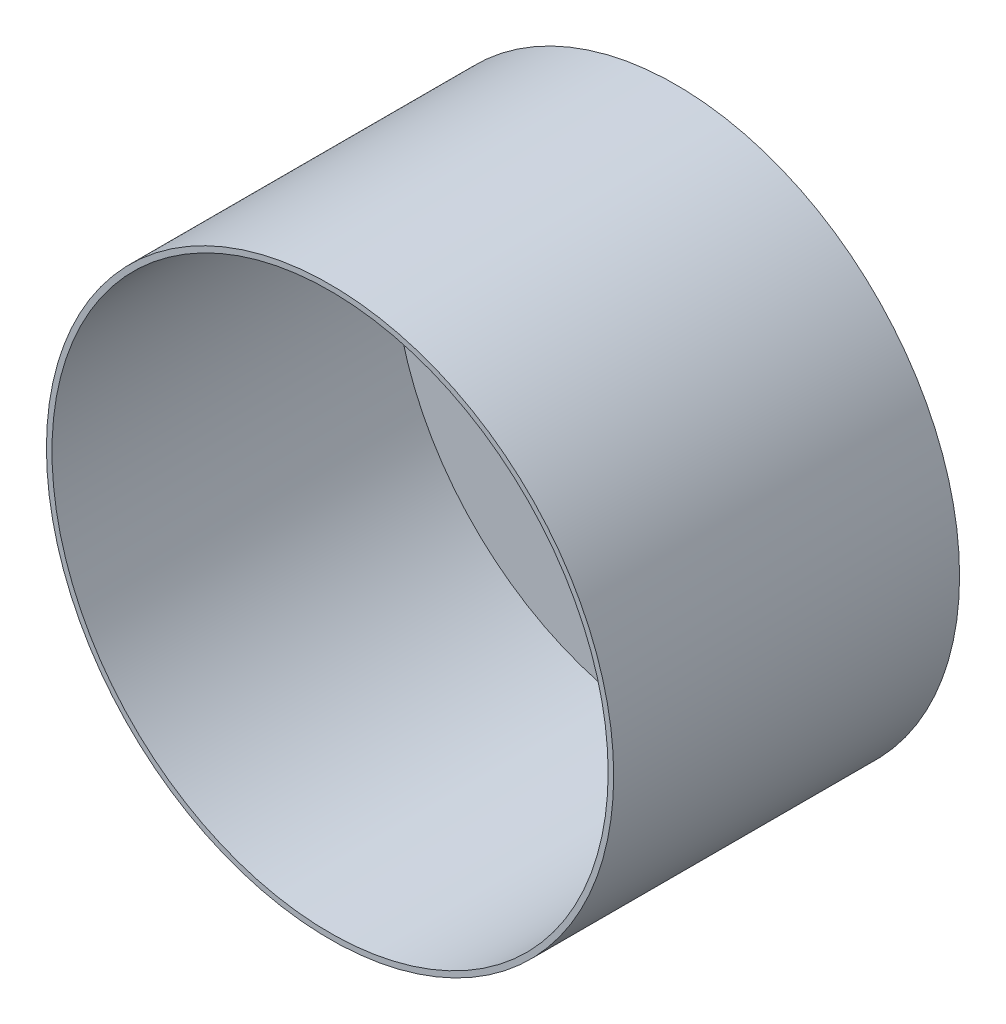
ISO-10303-21;
HEADER;
FILE_DESCRIPTION(('STEP AP214'),'2;1');
FILE_NAME('part.step','',(''),(''),'','','');
FILE_SCHEMA(('AUTOMOTIVE_DESIGN { 1 0 10303 214 1 1 1 1 }'));
ENDSEC;
DATA;
#1=APPLICATION_CONTEXT('core data for automotive mechanical design processes');
#2=APPLICATION_PROTOCOL_DEFINITION('international standard','automotive_design',2000,#1);
#3=PRODUCT_CONTEXT('',#1,'mechanical');
#4=PRODUCT('Part','Part','',(#3));
#5=PRODUCT_RELATED_PRODUCT_CATEGORY('part','',(#4));
#6=PRODUCT_DEFINITION_FORMATION('','',#4);
#7=PRODUCT_DEFINITION_CONTEXT('part definition',#1,'design');
#8=PRODUCT_DEFINITION('design','',#6,#7);
#9=PRODUCT_DEFINITION_SHAPE('','',#8);
#10=(LENGTH_UNIT() NAMED_UNIT(*) SI_UNIT(.MILLI.,.METRE.));
#11=(NAMED_UNIT(*) PLANE_ANGLE_UNIT() SI_UNIT($,.RADIAN.));
#12=(NAMED_UNIT(*) SI_UNIT($,.STERADIAN.) SOLID_ANGLE_UNIT());
#13=UNCERTAINTY_MEASURE_WITH_UNIT(LENGTH_MEASURE(1.E-05),#10,'distance_accuracy_value','');
#14=(GEOMETRIC_REPRESENTATION_CONTEXT(3) GLOBAL_UNCERTAINTY_ASSIGNED_CONTEXT((#13)) GLOBAL_UNIT_ASSIGNED_CONTEXT((#10,
#11,#12)) REPRESENTATION_CONTEXT('',''));
#15=CARTESIAN_POINT('',(0.,0.,0.));
#16=DIRECTION('',(0.,0.,1.));
#17=DIRECTION('',(1.,0.,0.));
#18=AXIS2_PLACEMENT_3D('',#15,#16,#17);
#19=CARTESIAN_POINT('',(0.,0.,1.5));
#20=DIRECTION('',(0.,0.,-1.));
#21=DIRECTION('',(-1.,0.,0.));
#22=AXIS2_PLACEMENT_3D('',#19,#20,#21);
#23=CYLINDRICAL_SURFACE('',#22,50.5);
#24=CARTESIAN_POINT('',(0.,0.,1.5));
#25=DIRECTION('',(0.,0.,1.));
#26=DIRECTION('',(1.,0.,0.));
#27=AXIS2_PLACEMENT_3D('',#24,#25,#26);
#28=CIRCLE('',#27,50.5);
#29=CARTESIAN_POINT('',(50.5,0.,1.5));
#30=VERTEX_POINT('',#29);
#31=EDGE_CURVE('E10',#30,#30,#28,.T.);
#32=ORIENTED_EDGE('',*,*,#31,.T.);
#33=EDGE_LOOP('',(#32));
#34=FACE_BOUND('',#33,.T.);
#35=CARTESIAN_POINT('',(0.,0.,0.));
#36=DIRECTION('',(0.,0.,1.));
#37=DIRECTION('',(1.,0.,0.));
#38=AXIS2_PLACEMENT_3D('',#35,#36,#37);
#39=CIRCLE('',#38,50.5);
#40=CARTESIAN_POINT('',(50.5,0.,0.));
#41=VERTEX_POINT('',#40);
#42=EDGE_CURVE('E40',#41,#41,#39,.T.);
#43=ORIENTED_EDGE('',*,*,#42,.F.);
#44=EDGE_LOOP('',(#43));
#45=FACE_BOUND('',#44,.T.);
#46=ADVANCED_FACE('F37',(#34,#45),#23,.F.);
#47=CARTESIAN_POINT('',(0.,0.,1.5));
#48=DIRECTION('',(0.,0.,1.));
#49=DIRECTION('',(1.,0.,0.));
#50=AXIS2_PLACEMENT_3D('',#47,#48,#49);
#51=PLANE('',#50);
#52=ORIENTED_EDGE('',*,*,#31,.F.);
#53=EDGE_LOOP('',(#52));
#54=FACE_BOUND('',#53,.T.);
#55=CARTESIAN_POINT('',(0.,0.,1.5));
#56=DIRECTION('',(0.,0.,1.));
#57=DIRECTION('',(1.,0.,0.));
#58=AXIS2_PLACEMENT_3D('',#55,#56,#57);
#59=CIRCLE('',#58,100.5);
#60=CARTESIAN_POINT('',(100.5,0.,1.5));
#61=VERTEX_POINT('',#60);
#62=EDGE_CURVE('E47',#61,#61,#59,.F.);
#63=ORIENTED_EDGE('',*,*,#62,.F.);
#64=EDGE_LOOP('',(#63));
#65=FACE_BOUND('',#64,.T.);
#66=ADVANCED_FACE('F77',(#54,#65),#51,.T.);
#67=CARTESIAN_POINT('',(0.,0.,0.));
#68=DIRECTION('',(0.,0.,1.));
#69=DIRECTION('',(1.,0.,0.));
#70=AXIS2_PLACEMENT_3D('',#67,#68,#69);
#71=PLANE('',#70);
#72=ORIENTED_EDGE('',*,*,#42,.T.);
#73=EDGE_LOOP('',(#72));
#74=FACE_BOUND('',#73,.T.);
#75=CARTESIAN_POINT('',(0.,0.,0.));
#76=DIRECTION('',(0.,0.,1.));
#77=DIRECTION('',(1.,0.,0.));
#78=AXIS2_PLACEMENT_3D('',#75,#76,#77);
#79=CIRCLE('',#78,102.5);
#80=CARTESIAN_POINT('',(102.5,0.,0.));
#81=VERTEX_POINT('',#80);
#82=EDGE_CURVE('E52',#81,#81,#79,.T.);
#83=ORIENTED_EDGE('',*,*,#82,.F.);
#84=EDGE_LOOP('',(#83));
#85=FACE_BOUND('',#84,.T.);
#86=ADVANCED_FACE('F75',(#74,#85),#71,.F.);
#87=CARTESIAN_POINT('',(0.,0.,125.));
#88=DIRECTION('',(0.,0.,-1.));
#89=DIRECTION('',(-1.,0.,0.));
#90=AXIS2_PLACEMENT_3D('',#87,#88,#89);
#91=CYLINDRICAL_SURFACE('',#90,100.5);
#92=ORIENTED_EDGE('',*,*,#62,.T.);
#93=EDGE_LOOP('',(#92));
#94=FACE_BOUND('',#93,.T.);
#95=CARTESIAN_POINT('',(0.,0.,125.));
#96=DIRECTION('',(0.,0.,1.));
#97=DIRECTION('',(1.,0.,0.));
#98=AXIS2_PLACEMENT_3D('',#95,#96,#97);
#99=CIRCLE('',#98,100.5);
#100=CARTESIAN_POINT('',(100.5,0.,125.));
#101=VERTEX_POINT('',#100);
#102=EDGE_CURVE('E55',#101,#101,#99,.T.);
#103=ORIENTED_EDGE('',*,*,#102,.T.);
#104=EDGE_LOOP('',(#103));
#105=FACE_BOUND('',#104,.T.);
#106=ADVANCED_FACE('F61',(#94,#105),#91,.F.);
#107=CARTESIAN_POINT('',(0.,0.,125.));
#108=DIRECTION('',(0.,0.,-1.));
#109=DIRECTION('',(-1.,0.,0.));
#110=AXIS2_PLACEMENT_3D('',#107,#108,#109);
#111=CYLINDRICAL_SURFACE('',#110,102.5);
#112=CARTESIAN_POINT('',(0.,0.,125.));
#113=DIRECTION('',(0.,0.,1.));
#114=DIRECTION('',(1.,0.,0.));
#115=AXIS2_PLACEMENT_3D('',#112,#113,#114);
#116=CIRCLE('',#115,102.5);
#117=CARTESIAN_POINT('',(102.5,0.,125.));
#118=VERTEX_POINT('',#117);
#119=EDGE_CURVE('E51',#118,#118,#116,.T.);
#120=ORIENTED_EDGE('',*,*,#119,.F.);
#121=EDGE_LOOP('',(#120));
#122=FACE_BOUND('',#121,.T.);
#123=ORIENTED_EDGE('',*,*,#82,.T.);
#124=EDGE_LOOP('',(#123));
#125=FACE_BOUND('',#124,.T.);
#126=ADVANCED_FACE('F66',(#122,#125),#111,.T.);
#127=CARTESIAN_POINT('',(0.,0.,125.));
#128=DIRECTION('',(0.,0.,1.));
#129=DIRECTION('',(1.,0.,0.));
#130=AXIS2_PLACEMENT_3D('',#127,#128,#129);
#131=PLANE('',#130);
#132=ORIENTED_EDGE('',*,*,#102,.F.);
#133=EDGE_LOOP('',(#132));
#134=FACE_BOUND('',#133,.T.);
#135=ORIENTED_EDGE('',*,*,#119,.T.);
#136=EDGE_LOOP('',(#135));
#137=FACE_BOUND('',#136,.T.);
#138=ADVANCED_FACE('F63',(#134,#137),#131,.T.);
#139=CLOSED_SHELL('',(#46,#66,#86,#106,#126,#138));
#140=MANIFOLD_SOLID_BREP('B2',#139);
#141=ADVANCED_BREP_SHAPE_REPRESENTATION('',(#18,#140),#14);
#142=SHAPE_DEFINITION_REPRESENTATION(#9,#141);
ENDSEC;
END-ISO-10303-21;
